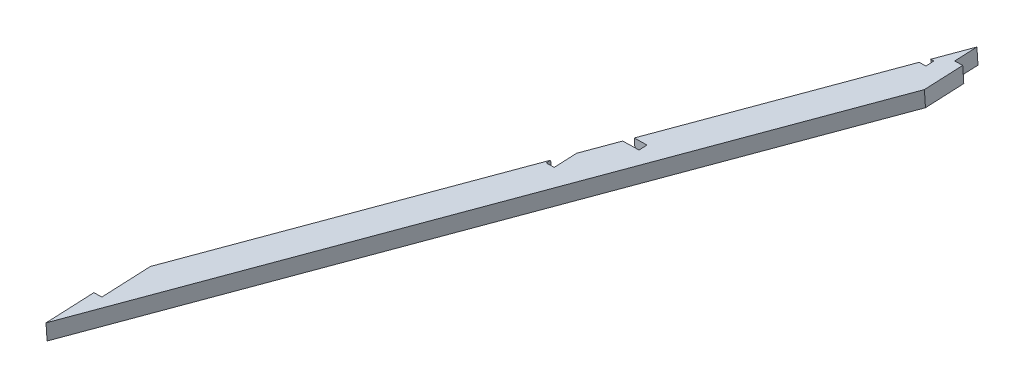
ISO-10303-21;
HEADER;
FILE_DESCRIPTION(('STEP AP214'),'2;1');
FILE_NAME('part.step','',(''),(''),'','','');
FILE_SCHEMA(('AUTOMOTIVE_DESIGN { 1 0 10303 214 1 1 1 1 }'));
ENDSEC;
DATA;
#1=APPLICATION_CONTEXT('core data for automotive mechanical design processes');
#2=APPLICATION_PROTOCOL_DEFINITION('international standard','automotive_design',2000,#1);
#3=PRODUCT_CONTEXT('',#1,'mechanical');
#4=PRODUCT('Part','Part','',(#3));
#5=PRODUCT_RELATED_PRODUCT_CATEGORY('part','',(#4));
#6=PRODUCT_DEFINITION_FORMATION('','',#4);
#7=PRODUCT_DEFINITION_CONTEXT('part definition',#1,'design');
#8=PRODUCT_DEFINITION('design','',#6,#7);
#9=PRODUCT_DEFINITION_SHAPE('','',#8);
#10=(LENGTH_UNIT() NAMED_UNIT(*) SI_UNIT(.MILLI.,.METRE.));
#11=(NAMED_UNIT(*) PLANE_ANGLE_UNIT() SI_UNIT($,.RADIAN.));
#12=(NAMED_UNIT(*) SI_UNIT($,.STERADIAN.) SOLID_ANGLE_UNIT());
#13=UNCERTAINTY_MEASURE_WITH_UNIT(LENGTH_MEASURE(1.E-05),#10,'distance_accuracy_value','');
#14=(GEOMETRIC_REPRESENTATION_CONTEXT(3) GLOBAL_UNCERTAINTY_ASSIGNED_CONTEXT((#13)) GLOBAL_UNIT_ASSIGNED_CONTEXT((#10,
#11,#12)) REPRESENTATION_CONTEXT('',''));
#15=CARTESIAN_POINT('',(0.,0.,0.));
#16=DIRECTION('',(0.,0.,1.));
#17=DIRECTION('',(1.,0.,0.));
#18=AXIS2_PLACEMENT_3D('',#15,#16,#17);
#19=CARTESIAN_POINT('',(364.27297918136,60.8553078660558,-343.26140953432));
#20=DIRECTION('',(-0.913176215467708,1.17576176539816E-13,-0.40756496353842));
#21=DIRECTION('',(-0.40756496353842,0.,0.913176215467708));
#22=AXIS2_PLACEMENT_3D('',#19,#20,#21);
#23=PLANE('',#22);
#24=DIRECTION('',(-0.407036793898781,-0.0508935265530076,0.911992816510964));
#25=VECTOR('',#24,1.);
#26=CARTESIAN_POINT('',(364.141264825195,67.1970788044048,-342.966294821213));
#27=LINE('',#26,#25);
#28=CARTESIAN_POINT('',(364.141264825195,67.1970788044048,-342.966294821213));
#29=VERTEX_POINT('',#28);
#30=CARTESIAN_POINT('',(329.209482269948,62.8294107467072,-264.699329190999));
#31=VERTEX_POINT('',#30);
#32=EDGE_CURVE('E202',#29,#31,#27,.T.);
#33=ORIENTED_EDGE('',*,*,#32,.F.);
#34=DIRECTION('',(-0.0207424182938109,0.99870408477937,0.0464747579695286));
#35=VECTOR('',#34,1.);
#36=CARTESIAN_POINT('',(364.27297918136,60.8553078660558,-343.26140953432));
#37=LINE('',#36,#35);
#38=CARTESIAN_POINT('',(364.27297918136,60.8553078660558,-343.26140953432));
#39=VERTEX_POINT('',#38);
#40=EDGE_CURVE('E11',#39,#29,#37,.T.);
#41=ORIENTED_EDGE('',*,*,#40,.F.);
#42=DIRECTION('',(-0.407036793898781,-0.0508935265530076,0.911992816510964));
#43=VECTOR('',#42,1.);
#44=CARTESIAN_POINT('',(364.27297918136,60.8553078660558,-343.26140953432));
#45=LINE('',#44,#43);
#46=CARTESIAN_POINT('',(329.341196626113,56.4876398083582,-264.994443904106));
#47=VERTEX_POINT('',#46);
#48=EDGE_CURVE('E258',#39,#47,#45,.T.);
#49=ORIENTED_EDGE('',*,*,#48,.T.);
#50=DIRECTION('',(-0.0207424182938109,0.99870408477937,0.0464747579695286));
#51=VECTOR('',#50,1.);
#52=CARTESIAN_POINT('',(329.341196626113,56.4876398083582,-264.994443904106));
#53=LINE('',#52,#51);
#54=EDGE_CURVE('E36',#47,#31,#53,.T.);
#55=ORIENTED_EDGE('',*,*,#54,.T.);
#56=EDGE_LOOP('',(#33,#41,#49,#55));
#57=FACE_BOUND('',#56,.T.);
#58=ADVANCED_FACE('F33',(#57),#23,.T.);
#59=CARTESIAN_POINT('',(364.27297918136,60.8553078660558,-343.26140953432));
#60=DIRECTION('',(-3.75435237648223E-05,0.0464839809289175,-0.998919034810872));
#61=DIRECTION('',(0.,0.998919035514868,0.0464839809616775));
#62=AXIS2_PLACEMENT_3D('',#59,#60,#61);
#63=PLANE('',#62);
#64=DIRECTION('',(-0.999784852192615,-0.0207217412878779,-0.000926695305848225));
#65=VECTOR('',#64,1.);
#66=CARTESIAN_POINT('',(364.141264825195,67.1970788044048,-342.966294821213));
#67=LINE('',#66,#65);
#68=CARTESIAN_POINT('',(366.826046244413,67.2527241223565,-342.963806311477));
#69=VERTEX_POINT('',#68);
#70=EDGE_CURVE('E256',#69,#29,#67,.T.);
#71=ORIENTED_EDGE('',*,*,#70,.F.);
#72=DIRECTION('',(-0.0207424182938109,0.99870408477937,0.0464747579695286));
#73=VECTOR('',#72,1.);
#74=CARTESIAN_POINT('',(366.957760600579,60.9109531840075,-343.258921024584));
#75=LINE('',#74,#73);
#76=CARTESIAN_POINT('',(366.957760600579,60.9109531840075,-343.258921024584));
#77=VERTEX_POINT('',#76);
#78=EDGE_CURVE('E42',#77,#69,#75,.T.);
#79=ORIENTED_EDGE('',*,*,#78,.F.);
#80=DIRECTION('',(-0.999784852192615,-0.0207217412878779,-0.000926695305848225));
#81=VECTOR('',#80,1.);
#82=CARTESIAN_POINT('',(364.27297918136,60.8553078660558,-343.26140953432));
#83=LINE('',#82,#81);
#84=EDGE_CURVE('E192',#77,#39,#83,.T.);
#85=ORIENTED_EDGE('',*,*,#84,.T.);
#86=ORIENTED_EDGE('',*,*,#40,.T.);
#87=EDGE_LOOP('',(#71,#79,#85,#86));
#88=FACE_BOUND('',#87,.T.);
#89=ADVANCED_FACE('F294',(#88),#63,.T.);
#90=CARTESIAN_POINT('',(366.957760600579,60.9109531840075,-343.258921024584));
#91=DIRECTION('',(-0.999784852192615,-0.0207217412878786,-0.000926695305820222));
#92=DIRECTION('',(0.020721750185429,-0.999785281482606,0.));
#93=AXIS2_PLACEMENT_3D('',#90,#91,#92);
#94=PLANE('',#93);
#95=DIRECTION('',(3.75435237928782E-05,-0.0464839809289197,0.998919034810872));
#96=VECTOR('',#95,1.);
#97=CARTESIAN_POINT('',(366.826046244413,67.2527241223565,-342.963806311477));
#98=LINE('',#97,#96);
#99=CARTESIAN_POINT('',(366.825927043725,67.4003107618058,-346.135374247002));
#100=VERTEX_POINT('',#99);
#101=EDGE_CURVE('E179',#100,#69,#98,.T.);
#102=ORIENTED_EDGE('',*,*,#101,.F.);
#103=DIRECTION('',(-0.0207424182938109,0.99870408477937,0.0464747579695286));
#104=VECTOR('',#103,1.);
#105=CARTESIAN_POINT('',(366.957641399891,61.0585398234568,-346.430488960108));
#106=LINE('',#105,#104);
#107=CARTESIAN_POINT('',(366.957641399891,61.0585398234568,-346.430488960108));
#108=VERTEX_POINT('',#107);
#109=EDGE_CURVE('E174',#108,#100,#106,.T.);
#110=ORIENTED_EDGE('',*,*,#109,.F.);
#111=DIRECTION('',(3.75435237928782E-05,-0.0464839809289197,0.998919034810872));
#112=VECTOR('',#111,1.);
#113=CARTESIAN_POINT('',(366.957760600579,60.9109531840075,-343.258921024584));
#114=LINE('',#113,#112);
#115=EDGE_CURVE('E177',#108,#77,#114,.T.);
#116=ORIENTED_EDGE('',*,*,#115,.T.);
#117=ORIENTED_EDGE('',*,*,#78,.T.);
#118=EDGE_LOOP('',(#102,#110,#116,#117));
#119=FACE_BOUND('',#118,.T.);
#120=ADVANCED_FACE('F176',(#119),#94,.T.);
#121=CARTESIAN_POINT('',(366.957641399891,61.0585398234568,-346.430488960108));
#122=DIRECTION('',(3.75435238199837E-05,-0.0464839809289164,0.998919034810872));
#123=DIRECTION('',(0.,-0.998919035514868,-0.0464839809616764));
#124=AXIS2_PLACEMENT_3D('',#121,#122,#123);
#125=PLANE('',#124);
#126=DIRECTION('',(0.999784852192615,0.0207217412878924,0.000926695305793668));
#127=VECTOR('',#126,1.);
#128=CARTESIAN_POINT('',(366.825927043725,67.4003107618058,-346.135374247002));
#129=LINE('',#128,#127);
#130=CARTESIAN_POINT('',(365.556200281441,67.3739941503702,-346.13655115004));
#131=VERTEX_POINT('',#130);
#132=EDGE_CURVE('E253',#131,#100,#129,.T.);
#133=ORIENTED_EDGE('',*,*,#132,.F.);
#134=DIRECTION('',(-0.0207424182938109,0.99870408477937,0.0464747579695286));
#135=VECTOR('',#134,1.);
#136=CARTESIAN_POINT('',(365.687914637606,61.0322232120212,-346.431665863147));
#137=LINE('',#136,#135);
#138=CARTESIAN_POINT('',(365.687914637606,61.0322232120212,-346.431665863147));
#139=VERTEX_POINT('',#138);
#140=EDGE_CURVE('E184',#139,#131,#137,.T.);
#141=ORIENTED_EDGE('',*,*,#140,.F.);
#142=DIRECTION('',(0.999784852192615,0.0207217412878924,0.000926695305793668));
#143=VECTOR('',#142,1.);
#144=CARTESIAN_POINT('',(366.957641399891,61.0585398234568,-346.430488960108));
#145=LINE('',#144,#143);
#146=EDGE_CURVE('E190',#139,#108,#145,.T.);
#147=ORIENTED_EDGE('',*,*,#146,.T.);
#148=ORIENTED_EDGE('',*,*,#109,.T.);
#149=EDGE_LOOP('',(#133,#141,#147,#148));
#150=FACE_BOUND('',#149,.T.);
#151=ADVANCED_FACE('F194',(#150),#125,.T.);
#152=CARTESIAN_POINT('',(371.353078166241,61.7405624943501,-359.124838863521));
#153=DIRECTION('',(-0.913176215467708,1.17616727408472E-13,-0.407564963538421));
#154=DIRECTION('',(-0.407564963538421,0.,0.913176215467708));
#155=AXIS2_PLACEMENT_3D('',#152,#153,#154);
#156=PLANE('',#155);
#157=DIRECTION('',(-0.407036793898781,-0.0508935265530086,0.911992816510963));
#158=VECTOR('',#157,1.);
#159=CARTESIAN_POINT('',(371.221363810076,68.0823334326991,-358.829724150414));
#160=LINE('',#159,#158);
#161=CARTESIAN_POINT('',(371.221363810076,68.0823334326991,-358.829724150414));
#162=VERTEX_POINT('',#161);
#163=EDGE_CURVE('E250',#162,#131,#160,.T.);
#164=ORIENTED_EDGE('',*,*,#163,.F.);
#165=DIRECTION('',(-0.0207424182938109,0.99870408477937,0.0464747579695286));
#166=VECTOR('',#165,1.);
#167=CARTESIAN_POINT('',(371.353078166241,61.7405624943501,-359.124838863521));
#168=LINE('',#167,#166);
#169=CARTESIAN_POINT('',(371.353078166241,61.7405624943501,-359.124838863521));
#170=VERTEX_POINT('',#169);
#171=EDGE_CURVE('E262',#170,#162,#168,.T.);
#172=ORIENTED_EDGE('',*,*,#171,.F.);
#173=DIRECTION('',(-0.407036793898781,-0.0508935265530086,0.911992816510963));
#174=VECTOR('',#173,1.);
#175=CARTESIAN_POINT('',(371.353078166241,61.7405624943501,-359.124838863521));
#176=LINE('',#175,#174);
#177=EDGE_CURVE('E195',#170,#139,#176,.T.);
#178=ORIENTED_EDGE('',*,*,#177,.T.);
#179=ORIENTED_EDGE('',*,*,#140,.T.);
#180=EDGE_LOOP('',(#164,#172,#178,#179));
#181=FACE_BOUND('',#180,.T.);
#182=ADVANCED_FACE('F307',(#181),#156,.T.);
#183=CARTESIAN_POINT('',(371.353078166241,61.7405624943501,-359.124838863521));
#184=DIRECTION('',(0.999784852192615,0.020721741287877,0.000926695305854155));
#185=DIRECTION('',(-0.0207217501854274,0.999785281482605,0.));
#186=AXIS2_PLACEMENT_3D('',#183,#184,#185);
#187=PLANE('',#186);
#188=DIRECTION('',(-3.75435237588767E-05,0.0464839809289185,-0.998919034810872));
#189=VECTOR('',#188,1.);
#190=CARTESIAN_POINT('',(371.221363810076,68.0823334326991,-358.829724150414));
#191=LINE('',#190,#189);
#192=CARTESIAN_POINT('',(371.221695348391,67.6718439738392,-350.008497442844));
#193=VERTEX_POINT('',#192);
#194=EDGE_CURVE('E247',#193,#162,#191,.T.);
#195=ORIENTED_EDGE('',*,*,#194,.F.);
#196=DIRECTION('',(-0.0207424182938109,0.99870408477937,0.0464747579695286));
#197=VECTOR('',#196,1.);
#198=CARTESIAN_POINT('',(371.353409704557,61.3300730354902,-350.30361215595));
#199=LINE('',#198,#197);
#200=CARTESIAN_POINT('',(371.353409704557,61.3300730354902,-350.30361215595));
#201=VERTEX_POINT('',#200);
#202=EDGE_CURVE('E264',#201,#193,#199,.T.);
#203=ORIENTED_EDGE('',*,*,#202,.F.);
#204=DIRECTION('',(-3.75435237588767E-05,0.0464839809289185,-0.998919034810872));
#205=VECTOR('',#204,1.);
#206=CARTESIAN_POINT('',(371.353078166241,61.7405624943501,-359.124838863521));
#207=LINE('',#206,#205);
#208=EDGE_CURVE('E197',#201,#170,#207,.T.);
#209=ORIENTED_EDGE('',*,*,#208,.T.);
#210=ORIENTED_EDGE('',*,*,#171,.T.);
#211=EDGE_LOOP('',(#195,#203,#209,#210));
#212=FACE_BOUND('',#211,.T.);
#213=ADVANCED_FACE('F310',(#212),#187,.T.);
#214=CARTESIAN_POINT('',(371.353409704557,61.3300730354902,-350.30361215595));
#215=DIRECTION('',(-3.75435237669905E-05,0.0464839809289175,-0.998919034810872));
#216=DIRECTION('',(0.,0.998919035514868,0.0464839809616775));
#217=AXIS2_PLACEMENT_3D('',#214,#215,#216);
#218=PLANE('',#217);
#219=DIRECTION('',(-0.999784852192615,-0.0207217412878791,-0.000926695305846111));
#220=VECTOR('',#219,1.);
#221=CARTESIAN_POINT('',(371.221695348391,67.6718439738392,-350.008497442844));
#222=LINE('',#221,#220);
#223=CARTESIAN_POINT('',(374.396012254103,67.7376355024282,-350.005555185248));
#224=VERTEX_POINT('',#223);
#225=EDGE_CURVE('E244',#224,#193,#222,.T.);
#226=ORIENTED_EDGE('',*,*,#225,.F.);
#227=DIRECTION('',(-0.0207424182938109,0.99870408477937,0.0464747579695286));
#228=VECTOR('',#227,1.);
#229=CARTESIAN_POINT('',(374.527726610269,61.3958645640792,-350.300669898354));
#230=LINE('',#229,#228);
#231=CARTESIAN_POINT('',(374.527726610269,61.3958645640792,-350.300669898354));
#232=VERTEX_POINT('',#231);
#233=EDGE_CURVE('E266',#232,#224,#230,.T.);
#234=ORIENTED_EDGE('',*,*,#233,.F.);
#235=DIRECTION('',(-0.999784852192615,-0.0207217412878791,-0.000926695305846111));
#236=VECTOR('',#235,1.);
#237=CARTESIAN_POINT('',(371.353409704557,61.3300730354902,-350.30361215595));
#238=LINE('',#237,#236);
#239=EDGE_CURVE('E549',#232,#201,#238,.T.);
#240=ORIENTED_EDGE('',*,*,#239,.T.);
#241=ORIENTED_EDGE('',*,*,#202,.T.);
#242=EDGE_LOOP('',(#226,#234,#240,#241));
#243=FACE_BOUND('',#242,.T.);
#244=ADVANCED_FACE('F314',(#243),#218,.T.);
#245=CARTESIAN_POINT('',(374.527714356163,60.6874365819702,-335.077144349531));
#246=DIRECTION('',(0.999784852897201,0.0207199583399856,0.000965009694883335));
#247=DIRECTION('',(-0.0207199679876578,0.999785318419205,0.));
#248=AXIS2_PLACEMENT_3D('',#245,#246,#247);
#249=PLANE('',#248);
#250=DIRECTION('',(8.04075142126767E-07,0.0464847756947473,-0.998918998531894));
#251=VECTOR('',#250,1.);
#252=CARTESIAN_POINT('',(374.395999999998,67.0292075203192,-334.782029636425));
#253=LINE('',#252,#251);
#254=CARTESIAN_POINT('',(374.395999999998,67.0292075203192,-334.782029636425));
#255=VERTEX_POINT('',#254);
#256=EDGE_CURVE('E241',#255,#224,#253,.T.);
#257=ORIENTED_EDGE('',*,*,#256,.F.);
#258=DIRECTION('',(-0.0207424182938109,0.99870408477937,0.0464747579695286));
#259=VECTOR('',#258,1.);
#260=CARTESIAN_POINT('',(374.527714356163,60.6874365819702,-335.077144349531));
#261=LINE('',#260,#259);
#262=CARTESIAN_POINT('',(374.527714356163,60.6874365819702,-335.077144349531));
#263=VERTEX_POINT('',#262);
#264=EDGE_CURVE('E268',#263,#255,#261,.T.);
#265=ORIENTED_EDGE('',*,*,#264,.F.);
#266=DIRECTION('',(8.04075142126767E-07,0.0464847756947473,-0.998918998531894));
#267=VECTOR('',#266,1.);
#268=CARTESIAN_POINT('',(374.527714356163,60.6874365819702,-335.077144349531));
#269=LINE('',#268,#267);
#270=EDGE_CURVE('E542',#263,#232,#269,.T.);
#271=ORIENTED_EDGE('',*,*,#270,.T.);
#272=ORIENTED_EDGE('',*,*,#233,.T.);
#273=EDGE_LOOP('',(#257,#265,#271,#272));
#274=FACE_BOUND('',#273,.T.);
#275=ADVANCED_FACE('F318',(#274),#249,.T.);
#276=CARTESIAN_POINT('',(374.527714356163,60.6874365819702,-335.077144349531));
#277=DIRECTION('',(0.913176215468969,0.,0.407564963535595));
#278=DIRECTION('',(0.407564963535595,0.,-0.913176215468969));
#279=AXIS2_PLACEMENT_3D('',#276,#277,#278);
#280=PLANE('',#279);
#281=DIRECTION('',(0.407036793895952,0.0508935265530076,-0.911992816512226));
#282=VECTOR('',#281,1.);
#283=CARTESIAN_POINT('',(374.395999999998,67.0292075203192,-334.782029636425));
#284=LINE('',#283,#282);
#285=CARTESIAN_POINT('',(266.700000000244,53.5635225556296,-93.4820296369579));
#286=VERTEX_POINT('',#285);
#287=EDGE_CURVE('E238',#286,#255,#284,.T.);
#288=ORIENTED_EDGE('',*,*,#287,.F.);
#289=DIRECTION('',(-0.0207424182938109,0.99870408477937,0.0464747579695286));
#290=VECTOR('',#289,1.);
#291=CARTESIAN_POINT('',(266.83171435641,47.2217516172806,-93.7771443500644));
#292=LINE('',#291,#290);
#293=CARTESIAN_POINT('',(266.83171435641,47.2217516172806,-93.7771443500644));
#294=VERTEX_POINT('',#293);
#295=EDGE_CURVE('E270',#294,#286,#292,.T.);
#296=ORIENTED_EDGE('',*,*,#295,.F.);
#297=DIRECTION('',(0.407036793895952,0.0508935265530076,-0.911992816512226));
#298=VECTOR('',#297,1.);
#299=CARTESIAN_POINT('',(374.527714356163,60.6874365819702,-335.077144349531));
#300=LINE('',#299,#298);
#301=EDGE_CURVE('E538',#294,#263,#300,.T.);
#302=ORIENTED_EDGE('',*,*,#301,.T.);
#303=ORIENTED_EDGE('',*,*,#264,.T.);
#304=EDGE_LOOP('',(#288,#296,#302,#303));
#305=FACE_BOUND('',#304,.T.);
#306=ADVANCED_FACE('F322',(#305),#280,.T.);
#307=CARTESIAN_POINT('',(266.831714356394,48.1072862768159,-112.806551286876));
#308=DIRECTION('',(-0.999784852897524,-0.0207199957253124,-0.000964206315296208));
#309=DIRECTION('',(0.0207200053569451,-0.999785317644747,0.));
#310=AXIS2_PLACEMENT_3D('',#307,#308,#309);
#311=PLANE('',#310);
#312=DIRECTION('',(8.07170020528009E-13,-0.0464847590307264,0.998918999307679));
#313=VECTOR('',#312,1.);
#314=CARTESIAN_POINT('',(266.700000000228,54.4490572151649,-112.511436573769));
#315=LINE('',#314,#313);
#316=CARTESIAN_POINT('',(266.700000000228,54.4490572151649,-112.511436573769));
#317=VERTEX_POINT('',#316);
#318=EDGE_CURVE('E235',#317,#286,#315,.T.);
#319=ORIENTED_EDGE('',*,*,#318,.F.);
#320=DIRECTION('',(-0.0207424182938109,0.99870408477937,0.0464747579695286));
#321=VECTOR('',#320,1.);
#322=CARTESIAN_POINT('',(266.831714356394,48.1072862768159,-112.806551286876));
#323=LINE('',#322,#321);
#324=CARTESIAN_POINT('',(266.831714356394,48.1072862768159,-112.806551286876));
#325=VERTEX_POINT('',#324);
#326=EDGE_CURVE('E272',#325,#317,#323,.T.);
#327=ORIENTED_EDGE('',*,*,#326,.F.);
#328=DIRECTION('',(8.07170020528009E-13,-0.0464847590307264,0.998918999307679));
#329=VECTOR('',#328,1.);
#330=CARTESIAN_POINT('',(266.831714356394,48.1072862768159,-112.806551286876));
#331=LINE('',#330,#329);
#332=EDGE_CURVE('E554',#325,#294,#331,.T.);
#333=ORIENTED_EDGE('',*,*,#332,.T.);
#334=ORIENTED_EDGE('',*,*,#295,.T.);
#335=EDGE_LOOP('',(#319,#327,#333,#334));
#336=FACE_BOUND('',#335,.T.);
#337=ADVANCED_FACE('F326',(#336),#311,.T.);
#338=CARTESIAN_POINT('',(270.006031264344,48.1730722632438,-112.803489931824));
#339=DIRECTION('',(-8.14338409227392E-13,0.0464847590307265,-0.998918999307679));
#340=DIRECTION('',(0.,0.998918999307679,0.0464847590307265));
#341=AXIS2_PLACEMENT_3D('',#338,#339,#340);
#342=PLANE('',#341);
#343=DIRECTION('',(-0.999784852897524,-0.0207199957253131,-0.000964206315289069));
#344=VECTOR('',#343,1.);
#345=CARTESIAN_POINT('',(269.874316908178,54.5148432015928,-112.508375218718));
#346=LINE('',#345,#344);
#347=CARTESIAN_POINT('',(269.874316908178,54.5148432015928,-112.508375218718));
#348=VERTEX_POINT('',#347);
#349=EDGE_CURVE('E232',#348,#317,#346,.T.);
#350=ORIENTED_EDGE('',*,*,#349,.F.);
#351=DIRECTION('',(-0.0207424182938109,0.99870408477937,0.0464747579695286));
#352=VECTOR('',#351,1.);
#353=CARTESIAN_POINT('',(270.006031264344,48.1730722632438,-112.803489931824));
#354=LINE('',#353,#352);
#355=CARTESIAN_POINT('',(270.006031264344,48.1730722632438,-112.803489931824));
#356=VERTEX_POINT('',#355);
#357=EDGE_CURVE('E274',#356,#348,#354,.T.);
#358=ORIENTED_EDGE('',*,*,#357,.F.);
#359=DIRECTION('',(-0.999784852897524,-0.0207199957253131,-0.000964206315289069));
#360=VECTOR('',#359,1.);
#361=CARTESIAN_POINT('',(270.006031264344,48.1730722632438,-112.803489931824));
#362=LINE('',#361,#360);
#363=EDGE_CURVE('E531',#356,#325,#362,.T.);
#364=ORIENTED_EDGE('',*,*,#363,.T.);
#365=ORIENTED_EDGE('',*,*,#326,.T.);
#366=EDGE_LOOP('',(#350,#358,#364,#365));
#367=FACE_BOUND('',#366,.T.);
#368=ADVANCED_FACE('F330',(#367),#342,.T.);
#369=CARTESIAN_POINT('',(270.006031264328,49.0687139050207,-132.050087552147));
#370=DIRECTION('',(-0.999784852897524,-0.0207199957253125,-0.000964206315293799));
#371=DIRECTION('',(0.0207200053569452,-0.999785317644747,0.));
#372=AXIS2_PLACEMENT_3D('',#369,#370,#371);
#373=PLANE('',#372);
#374=DIRECTION('',(8.09585760026587E-13,-0.0464847590307266,0.998918999307679));
#375=VECTOR('',#374,1.);
#376=CARTESIAN_POINT('',(269.874316908162,55.4104848433697,-131.754972839041));
#377=LINE('',#376,#375);
#378=CARTESIAN_POINT('',(269.874316908162,55.4104848433697,-131.754972839041));
#379=VERTEX_POINT('',#378);
#380=EDGE_CURVE('E229',#379,#348,#377,.T.);
#381=ORIENTED_EDGE('',*,*,#380,.F.);
#382=DIRECTION('',(-0.0207424182938109,0.99870408477937,0.0464747579695286));
#383=VECTOR('',#382,1.);
#384=CARTESIAN_POINT('',(270.006031264328,49.0687139050207,-132.050087552147));
#385=LINE('',#384,#383);
#386=CARTESIAN_POINT('',(270.006031264328,49.0687139050207,-132.050087552147));
#387=VERTEX_POINT('',#386);
#388=EDGE_CURVE('E276',#387,#379,#385,.T.);
#389=ORIENTED_EDGE('',*,*,#388,.F.);
#390=DIRECTION('',(8.09585760026587E-13,-0.0464847590307266,0.998918999307679));
#391=VECTOR('',#390,1.);
#392=CARTESIAN_POINT('',(270.006031264328,49.0687139050207,-132.050087552147));
#393=LINE('',#392,#391);
#394=EDGE_CURVE('E527',#387,#356,#393,.T.);
#395=ORIENTED_EDGE('',*,*,#394,.T.);
#396=ORIENTED_EDGE('',*,*,#357,.T.);
#397=EDGE_LOOP('',(#381,#389,#395,#396));
#398=FACE_BOUND('',#397,.T.);
#399=ADVANCED_FACE('F334',(#398),#373,.T.);
#400=CARTESIAN_POINT('',(319.092469835739,55.2061982854817,-242.03149472775));
#401=DIRECTION('',(-0.913176215467708,1.17591116333531E-13,-0.40756496353842));
#402=DIRECTION('',(-0.40756496353842,0.,0.913176215467708));
#403=AXIS2_PLACEMENT_3D('',#400,#401,#402);
#404=PLANE('',#403);
#405=DIRECTION('',(-0.407036793898781,-0.0508935265530076,0.911992816510963));
#406=VECTOR('',#405,1.);
#407=CARTESIAN_POINT('',(318.960755479574,61.5479692238307,-241.736380014644));
#408=LINE('',#407,#406);
#409=CARTESIAN_POINT('',(318.960755479574,61.5479692238307,-241.736380014644));
#410=VERTEX_POINT('',#409);
#411=EDGE_CURVE('E226',#410,#379,#408,.T.);
#412=ORIENTED_EDGE('',*,*,#411,.F.);
#413=DIRECTION('',(-0.0207424182938109,0.99870408477937,0.0464747579695286));
#414=VECTOR('',#413,1.);
#415=CARTESIAN_POINT('',(319.092469835739,55.2061982854817,-242.03149472775));
#416=LINE('',#415,#414);
#417=CARTESIAN_POINT('',(319.092469835739,55.2061982854817,-242.03149472775));
#418=VERTEX_POINT('',#417);
#419=EDGE_CURVE('E278',#418,#410,#416,.T.);
#420=ORIENTED_EDGE('',*,*,#419,.F.);
#421=DIRECTION('',(-0.407036793898781,-0.0508935265530076,0.911992816510963));
#422=VECTOR('',#421,1.);
#423=CARTESIAN_POINT('',(319.092469835739,55.2061982854817,-242.03149472775));
#424=LINE('',#423,#422);
#425=EDGE_CURVE('E558',#418,#387,#424,.T.);
#426=ORIENTED_EDGE('',*,*,#425,.T.);
#427=ORIENTED_EDGE('',*,*,#388,.T.);
#428=EDGE_LOOP('',(#412,#420,#426,#427));
#429=FACE_BOUND('',#428,.T.);
#430=ADVANCED_FACE('F338',(#429),#404,.T.);
#431=CARTESIAN_POINT('',(319.092536201098,55.124028959484,-240.265714298098));
#432=DIRECTION('',(0.999784852192615,0.0207217412878769,0.000926695305855354));
#433=DIRECTION('',(-0.0207217501854274,0.999785281482605,0.));
#434=AXIS2_PLACEMENT_3D('',#431,#432,#433);
#435=PLANE('',#434);
#436=DIRECTION('',(-3.75435237576673E-05,0.046483980928918,-0.998919034810872));
#437=VECTOR('',#436,1.);
#438=CARTESIAN_POINT('',(318.960821844932,61.465799897833,-239.970599584991));
#439=LINE('',#438,#437);
#440=CARTESIAN_POINT('',(318.960821844932,61.465799897833,-239.970599584991));
#441=VERTEX_POINT('',#440);
#442=EDGE_CURVE('E223',#441,#410,#439,.T.);
#443=ORIENTED_EDGE('',*,*,#442,.F.);
#444=DIRECTION('',(-0.0207424182938109,0.99870408477937,0.0464747579695286));
#445=VECTOR('',#444,1.);
#446=CARTESIAN_POINT('',(319.092536201098,55.124028959484,-240.265714298098));
#447=LINE('',#446,#445);
#448=CARTESIAN_POINT('',(319.092536201098,55.124028959484,-240.265714298098));
#449=VERTEX_POINT('',#448);
#450=EDGE_CURVE('E280',#449,#441,#447,.T.);
#451=ORIENTED_EDGE('',*,*,#450,.F.);
#452=DIRECTION('',(-3.75435237576673E-05,0.046483980928918,-0.998919034810872));
#453=VECTOR('',#452,1.);
#454=CARTESIAN_POINT('',(319.092536201098,55.124028959484,-240.265714298098));
#455=LINE('',#454,#453);
#456=EDGE_CURVE('E520',#449,#418,#455,.T.);
#457=ORIENTED_EDGE('',*,*,#456,.T.);
#458=ORIENTED_EDGE('',*,*,#419,.T.);
#459=EDGE_LOOP('',(#443,#451,#457,#458));
#460=FACE_BOUND('',#459,.T.);
#461=ADVANCED_FACE('F342',(#460),#435,.T.);
#462=CARTESIAN_POINT('',(322.266853106809,55.1898204880731,-240.262772040502));
#463=DIRECTION('',(-3.754352375826E-05,0.0464839809289177,-0.998919034810872));
#464=DIRECTION('',(0.,0.998919035514868,0.0464839809616776));
#465=AXIS2_PLACEMENT_3D('',#462,#463,#464);
#466=PLANE('',#465);
#467=DIRECTION('',(-0.999784852192615,-0.0207217412878791,-0.000926695305854853));
#468=VECTOR('',#467,1.);
#469=CARTESIAN_POINT('',(322.135138750643,61.5315914264221,-239.967657327395));
#470=LINE('',#469,#468);
#471=CARTESIAN_POINT('',(322.135138750643,61.5315914264221,-239.967657327395));
#472=VERTEX_POINT('',#471);
#473=EDGE_CURVE('E220',#472,#441,#470,.T.);
#474=ORIENTED_EDGE('',*,*,#473,.F.);
#475=DIRECTION('',(-0.0207424182938109,0.99870408477937,0.0464747579695286));
#476=VECTOR('',#475,1.);
#477=CARTESIAN_POINT('',(322.266853106809,55.1898204880731,-240.262772040502));
#478=LINE('',#477,#476);
#479=CARTESIAN_POINT('',(322.266853106809,55.1898204880731,-240.262772040502));
#480=VERTEX_POINT('',#479);
#481=EDGE_CURVE('E282',#480,#472,#478,.T.);
#482=ORIENTED_EDGE('',*,*,#481,.F.);
#483=DIRECTION('',(-0.999784852192615,-0.0207217412878791,-0.000926695305854853));
#484=VECTOR('',#483,1.);
#485=CARTESIAN_POINT('',(322.266853106809,55.1898204880731,-240.262772040502));
#486=LINE('',#485,#484);
#487=EDGE_CURVE('E516',#480,#449,#486,.T.);
#488=ORIENTED_EDGE('',*,*,#487,.T.);
#489=ORIENTED_EDGE('',*,*,#450,.T.);
#490=EDGE_LOOP('',(#474,#482,#488,#489));
#491=FACE_BOUND('',#490,.T.);
#492=ADVANCED_FACE('F346',(#491),#466,.T.);
#493=CARTESIAN_POINT('',(322.266519344883,55.6030630785311,-249.14316225997));
#494=DIRECTION('',(-0.999784852192615,-0.0207217412878769,-0.000926695305855096));
#495=DIRECTION('',(0.0207217501854274,-0.999785281482605,0.));
#496=AXIS2_PLACEMENT_3D('',#493,#494,#495);
#497=PLANE('',#496);
#498=DIRECTION('',(3.75435237579103E-05,-0.0464839809289173,0.998919034810872));
#499=VECTOR('',#498,1.);
#500=CARTESIAN_POINT('',(322.134804988717,61.9448340168801,-248.848047546864));
#501=LINE('',#500,#499);
#502=CARTESIAN_POINT('',(322.134804988717,61.9448340168801,-248.848047546864));
#503=VERTEX_POINT('',#502);
#504=EDGE_CURVE('E217',#503,#472,#501,.T.);
#505=ORIENTED_EDGE('',*,*,#504,.F.);
#506=DIRECTION('',(-0.0207424182938109,0.99870408477937,0.0464747579695286));
#507=VECTOR('',#506,1.);
#508=CARTESIAN_POINT('',(322.266519344883,55.6030630785311,-249.14316225997));
#509=LINE('',#508,#507);
#510=CARTESIAN_POINT('',(322.266519344883,55.6030630785311,-249.14316225997));
#511=VERTEX_POINT('',#510);
#512=EDGE_CURVE('E284',#511,#503,#509,.T.);
#513=ORIENTED_EDGE('',*,*,#512,.F.);
#514=DIRECTION('',(3.75435237579103E-05,-0.0464839809289173,0.998919034810872));
#515=VECTOR('',#514,1.);
#516=CARTESIAN_POINT('',(322.266519344883,55.6030630785311,-249.14316225997));
#517=LINE('',#516,#515);
#518=EDGE_CURVE('E562',#511,#480,#517,.T.);
#519=ORIENTED_EDGE('',*,*,#518,.T.);
#520=ORIENTED_EDGE('',*,*,#481,.T.);
#521=EDGE_LOOP('',(#505,#513,#519,#520));
#522=FACE_BOUND('',#521,.T.);
#523=ADVANCED_FACE('F350',(#522),#497,.T.);
#524=CARTESIAN_POINT('',(327.926261169867,56.3107244623928,-261.824187575279));
#525=DIRECTION('',(-0.913176215467711,1.17228292771873E-13,-0.407564963538414));
#526=DIRECTION('',(-0.407564963538414,0.,0.913176215467711));
#527=AXIS2_PLACEMENT_3D('',#524,#525,#526);
#528=PLANE('',#527);
#529=DIRECTION('',(-0.407036793898774,-0.0508935265530077,0.911992816510966));
#530=VECTOR('',#529,1.);
#531=CARTESIAN_POINT('',(327.794546813701,62.6524954007418,-261.529072862172));
#532=LINE('',#531,#530);
#533=CARTESIAN_POINT('',(327.794546813701,62.6524954007418,-261.529072862172));
#534=VERTEX_POINT('',#533);
#535=EDGE_CURVE('E214',#534,#503,#532,.T.);
#536=ORIENTED_EDGE('',*,*,#535,.F.);
#537=DIRECTION('',(-0.0207424182938109,0.99870408477937,0.0464747579695286));
#538=VECTOR('',#537,1.);
#539=CARTESIAN_POINT('',(327.926261169867,56.3107244623928,-261.824187575279));
#540=LINE('',#539,#538);
#541=CARTESIAN_POINT('',(327.926261169867,56.3107244623928,-261.824187575279));
#542=VERTEX_POINT('',#541);
#543=EDGE_CURVE('E286',#542,#534,#540,.T.);
#544=ORIENTED_EDGE('',*,*,#543,.F.);
#545=DIRECTION('',(-0.407036793898774,-0.0508935265530077,0.911992816510966));
#546=VECTOR('',#545,1.);
#547=CARTESIAN_POINT('',(327.926261169867,56.3107244623928,-261.824187575279));
#548=LINE('',#547,#546);
#549=EDGE_CURVE('E509',#542,#511,#548,.T.);
#550=ORIENTED_EDGE('',*,*,#549,.T.);
#551=ORIENTED_EDGE('',*,*,#512,.T.);
#552=EDGE_LOOP('',(#536,#544,#550,#551));
#553=FACE_BOUND('',#552,.T.);
#554=ADVANCED_FACE('F354',(#553),#528,.T.);
#555=CARTESIAN_POINT('',(327.926261169867,56.3107244623928,-261.824187575279));
#556=DIRECTION('',(-3.75435237711745E-05,0.0464839809289174,-0.998919034810872));
#557=DIRECTION('',(0.,0.998919035514868,0.0464839809616774));
#558=AXIS2_PLACEMENT_3D('',#555,#556,#557);
#559=PLANE('',#558);
#560=DIRECTION('',(-0.999784852192615,-0.0207217412878771,-0.00092669530584183));
#561=VECTOR('',#560,1.);
#562=CARTESIAN_POINT('',(327.794546813701,62.6524954007418,-261.529072862172));
#563=LINE('',#562,#561);
#564=CARTESIAN_POINT('',(334.288508519774,62.7870905530003,-261.523053643321));
#565=VERTEX_POINT('',#564);
#566=EDGE_CURVE('E211',#565,#534,#563,.T.);
#567=ORIENTED_EDGE('',*,*,#566,.F.);
#568=DIRECTION('',(-0.0207424182938109,0.99870408477937,0.0464747579695286));
#569=VECTOR('',#568,1.);
#570=CARTESIAN_POINT('',(334.42022287594,56.4453196146513,-261.818168356428));
#571=LINE('',#570,#569);
#572=CARTESIAN_POINT('',(334.42022287594,56.4453196146513,-261.818168356428));
#573=VERTEX_POINT('',#572);
#574=EDGE_CURVE('E288',#573,#565,#571,.T.);
#575=ORIENTED_EDGE('',*,*,#574,.F.);
#576=DIRECTION('',(-0.999784852192615,-0.0207217412878771,-0.00092669530584183));
#577=VECTOR('',#576,1.);
#578=CARTESIAN_POINT('',(327.926261169867,56.3107244623928,-261.824187575279));
#579=LINE('',#578,#577);
#580=EDGE_CURVE('E505',#573,#542,#579,.T.);
#581=ORIENTED_EDGE('',*,*,#580,.T.);
#582=ORIENTED_EDGE('',*,*,#543,.T.);
#583=EDGE_LOOP('',(#567,#575,#581,#582));
#584=FACE_BOUND('',#583,.T.);
#585=ADVANCED_FACE('F358',(#584),#559,.T.);
#586=CARTESIAN_POINT('',(334.42022287594,56.4453196146513,-261.818168356428));
#587=DIRECTION('',(-0.999784852192615,-0.0207217412878786,-0.000926695305820132));
#588=DIRECTION('',(0.020721750185429,-0.999785281482605,0.));
#589=AXIS2_PLACEMENT_3D('',#586,#587,#588);
#590=PLANE('',#589);
#591=DIRECTION('',(3.75435237928782E-05,-0.0464839809289153,0.998919034810872));
#592=VECTOR('',#591,1.);
#593=CARTESIAN_POINT('',(334.288508519774,62.7870905530003,-261.523053643321));
#594=LINE('',#593,#592);
#595=CARTESIAN_POINT('',(334.288389319086,62.9346771924496,-264.694621578846));
#596=VERTEX_POINT('',#595);
#597=EDGE_CURVE('E208',#596,#565,#594,.T.);
#598=ORIENTED_EDGE('',*,*,#597,.F.);
#599=DIRECTION('',(-0.0207424182938109,0.99870408477937,0.0464747579695286));
#600=VECTOR('',#599,1.);
#601=CARTESIAN_POINT('',(334.420103675252,56.5929062541006,-264.989736291952));
#602=LINE('',#601,#600);
#603=CARTESIAN_POINT('',(334.420103675252,56.5929062541006,-264.989736291952));
#604=VERTEX_POINT('',#603);
#605=EDGE_CURVE('E289',#604,#596,#602,.T.);
#606=ORIENTED_EDGE('',*,*,#605,.F.);
#607=DIRECTION('',(3.75435237928782E-05,-0.0464839809289153,0.998919034810872));
#608=VECTOR('',#607,1.);
#609=CARTESIAN_POINT('',(334.42022287594,56.4453196146513,-261.818168356428));
#610=LINE('',#609,#608);
#611=EDGE_CURVE('E566',#604,#573,#610,.T.);
#612=ORIENTED_EDGE('',*,*,#611,.T.);
#613=ORIENTED_EDGE('',*,*,#574,.T.);
#614=EDGE_LOOP('',(#598,#606,#612,#613));
#615=FACE_BOUND('',#614,.T.);
#616=ADVANCED_FACE('F362',(#615),#590,.T.);
#617=CARTESIAN_POINT('',(334.420103675252,56.5929062541006,-264.989736291952));
#618=DIRECTION('',(3.75435237537423E-05,-0.0464839809289178,0.998919034810872));
#619=DIRECTION('',(0.,-0.998919035514868,-0.0464839809616777));
#620=AXIS2_PLACEMENT_3D('',#617,#618,#619);
#621=PLANE('',#620);
#622=DIRECTION('',(0.999784852192615,0.0207217412878758,0.000926695305859222));
#623=VECTOR('',#622,1.);
#624=CARTESIAN_POINT('',(334.288389319086,62.9346771924496,-264.694621578846));
#625=LINE('',#624,#623);
#626=EDGE_CURVE('E205',#31,#596,#625,.T.);
#627=ORIENTED_EDGE('',*,*,#626,.F.);
#628=ORIENTED_EDGE('',*,*,#54,.F.);
#629=DIRECTION('',(0.999784852192615,0.0207217412878758,0.000926695305859222));
#630=VECTOR('',#629,1.);
#631=CARTESIAN_POINT('',(334.420103675252,56.5929062541006,-264.989736291952));
#632=LINE('',#631,#630);
#633=EDGE_CURVE('E568',#47,#604,#632,.T.);
#634=ORIENTED_EDGE('',*,*,#633,.T.);
#635=ORIENTED_EDGE('',*,*,#605,.T.);
#636=EDGE_LOOP('',(#627,#628,#634,#635));
#637=FACE_BOUND('',#636,.T.);
#638=ADVANCED_FACE('F291',(#637),#621,.T.);
#639=CARTESIAN_POINT('',(-0.773019133922822,37.2192555239168,1.73200041798387));
#640=DIRECTION('',(0.0207424182938113,-0.99870408477937,-0.0464747579695284));
#641=DIRECTION('',(0.,0.0464847590307432,-0.998918999307678));
#642=AXIS2_PLACEMENT_3D('',#639,#640,#641);
#643=PLANE('',#642);
#644=ORIENTED_EDGE('',*,*,#48,.F.);
#645=ORIENTED_EDGE('',*,*,#84,.F.);
#646=ORIENTED_EDGE('',*,*,#115,.F.);
#647=ORIENTED_EDGE('',*,*,#146,.F.);
#648=ORIENTED_EDGE('',*,*,#177,.F.);
#649=ORIENTED_EDGE('',*,*,#208,.F.);
#650=ORIENTED_EDGE('',*,*,#239,.F.);
#651=ORIENTED_EDGE('',*,*,#270,.F.);
#652=ORIENTED_EDGE('',*,*,#301,.F.);
#653=ORIENTED_EDGE('',*,*,#332,.F.);
#654=ORIENTED_EDGE('',*,*,#363,.F.);
#655=ORIENTED_EDGE('',*,*,#394,.F.);
#656=ORIENTED_EDGE('',*,*,#425,.F.);
#657=ORIENTED_EDGE('',*,*,#456,.F.);
#658=ORIENTED_EDGE('',*,*,#487,.F.);
#659=ORIENTED_EDGE('',*,*,#518,.F.);
#660=ORIENTED_EDGE('',*,*,#549,.F.);
#661=ORIENTED_EDGE('',*,*,#580,.F.);
#662=ORIENTED_EDGE('',*,*,#611,.F.);
#663=ORIENTED_EDGE('',*,*,#633,.F.);
#664=EDGE_LOOP('',(#644,#645,#646,#647,#648,#649,#650,#651,#652,#653,#654,#655,#656,#657,#658,
#659,#660,#661,#662,#663));
#665=FACE_BOUND('',#664,.T.);
#666=ADVANCED_FACE('F188',(#665),#643,.T.);
#667=CARTESIAN_POINT('',(-0.904733490088521,43.5610264622658,2.02711513109038));
#668=DIRECTION('',(0.0207424182938113,-0.99870408477937,-0.0464747579695284));
#669=DIRECTION('',(0.,0.0464847590307432,-0.998918999307678));
#670=AXIS2_PLACEMENT_3D('',#667,#668,#669);
#671=PLANE('',#670);
#672=ORIENTED_EDGE('',*,*,#32,.T.);
#673=ORIENTED_EDGE('',*,*,#626,.T.);
#674=ORIENTED_EDGE('',*,*,#597,.T.);
#675=ORIENTED_EDGE('',*,*,#566,.T.);
#676=ORIENTED_EDGE('',*,*,#535,.T.);
#677=ORIENTED_EDGE('',*,*,#504,.T.);
#678=ORIENTED_EDGE('',*,*,#473,.T.);
#679=ORIENTED_EDGE('',*,*,#442,.T.);
#680=ORIENTED_EDGE('',*,*,#411,.T.);
#681=ORIENTED_EDGE('',*,*,#380,.T.);
#682=ORIENTED_EDGE('',*,*,#349,.T.);
#683=ORIENTED_EDGE('',*,*,#318,.T.);
#684=ORIENTED_EDGE('',*,*,#287,.T.);
#685=ORIENTED_EDGE('',*,*,#256,.T.);
#686=ORIENTED_EDGE('',*,*,#225,.T.);
#687=ORIENTED_EDGE('',*,*,#194,.T.);
#688=ORIENTED_EDGE('',*,*,#163,.T.);
#689=ORIENTED_EDGE('',*,*,#132,.T.);
#690=ORIENTED_EDGE('',*,*,#101,.T.);
#691=ORIENTED_EDGE('',*,*,#70,.T.);
#692=EDGE_LOOP('',(#672,#673,#674,#675,#676,#677,#678,#679,#680,#681,#682,#683,#684,#685,#686,
#687,#688,#689,#690,#691));
#693=FACE_BOUND('',#692,.T.);
#694=ADVANCED_FACE('F293',(#693),#671,.F.);
#695=CLOSED_SHELL('',(#58,#89,#120,#151,#182,#213,#244,#275,#306,#337,#368,#399,#430,#461,#492,
#523,#554,#585,#616,#638,#666,#694));
#696=MANIFOLD_SOLID_BREP('B2',#695);
#697=ADVANCED_BREP_SHAPE_REPRESENTATION('',(#18,#696),#14);
#698=SHAPE_DEFINITION_REPRESENTATION(#9,#697);
ENDSEC;
END-ISO-10303-21;
